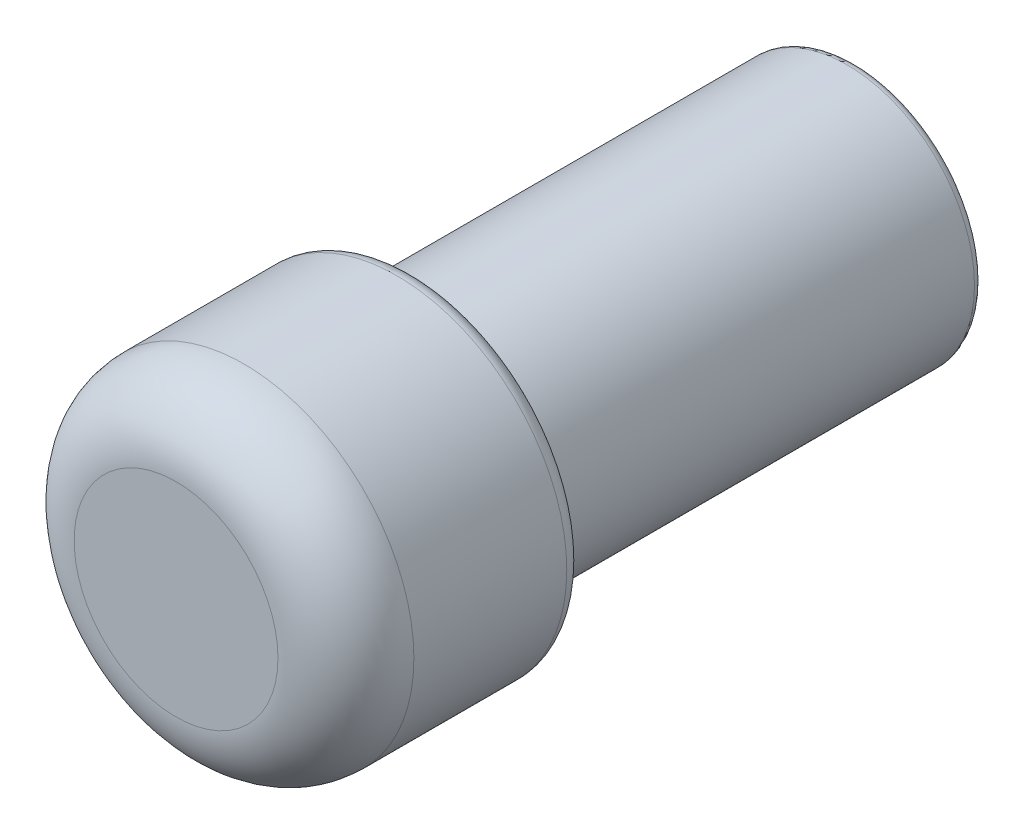
ISO-10303-21;
HEADER;
FILE_DESCRIPTION(('STEP AP214'),'2;1');
FILE_NAME('part.step','',(''),(''),'','','');
FILE_SCHEMA(('AUTOMOTIVE_DESIGN { 1 0 10303 214 1 1 1 1 }'));
ENDSEC;
DATA;
#1=APPLICATION_CONTEXT('core data for automotive mechanical design processes');
#2=APPLICATION_PROTOCOL_DEFINITION('international standard','automotive_design',2000,#1);
#3=PRODUCT_CONTEXT('',#1,'mechanical');
#4=PRODUCT('Part','Part','',(#3));
#5=PRODUCT_RELATED_PRODUCT_CATEGORY('part','',(#4));
#6=PRODUCT_DEFINITION_FORMATION('','',#4);
#7=PRODUCT_DEFINITION_CONTEXT('part definition',#1,'design');
#8=PRODUCT_DEFINITION('design','',#6,#7);
#9=PRODUCT_DEFINITION_SHAPE('','',#8);
#10=(LENGTH_UNIT() NAMED_UNIT(*) SI_UNIT(.MILLI.,.METRE.));
#11=(NAMED_UNIT(*) PLANE_ANGLE_UNIT() SI_UNIT($,.RADIAN.));
#12=(NAMED_UNIT(*) SI_UNIT($,.STERADIAN.) SOLID_ANGLE_UNIT());
#13=UNCERTAINTY_MEASURE_WITH_UNIT(LENGTH_MEASURE(1.E-05),#10,'distance_accuracy_value','');
#14=(GEOMETRIC_REPRESENTATION_CONTEXT(3) GLOBAL_UNCERTAINTY_ASSIGNED_CONTEXT((#13)) GLOBAL_UNIT_ASSIGNED_CONTEXT((#10,
#11,#12)) REPRESENTATION_CONTEXT('',''));
#15=CARTESIAN_POINT('',(0.,0.,0.));
#16=DIRECTION('',(0.,0.,1.));
#17=DIRECTION('',(1.,0.,0.));
#18=AXIS2_PLACEMENT_3D('',#15,#16,#17);
#19=CARTESIAN_POINT('',(0.,0.,13.));
#20=DIRECTION('',(0.,0.,-1.));
#21=DIRECTION('',(-1.,0.,0.));
#22=AXIS2_PLACEMENT_3D('',#19,#20,#21);
#23=CYLINDRICAL_SURFACE('',#22,3.75);
#24=CARTESIAN_POINT('',(0.,0.,0.25));
#25=DIRECTION('',(0.,0.,1.));
#26=DIRECTION('',(1.,0.,0.));
#27=AXIS2_PLACEMENT_3D('',#24,#25,#26);
#28=CIRCLE('',#27,3.75);
#29=CARTESIAN_POINT('',(-3.75,0.,0.25));
#30=VERTEX_POINT('',#29);
#31=EDGE_CURVE('E56',#30,#30,#28,.T.);
#32=CARTESIAN_POINT('',(0.,0.,12.5));
#33=DIRECTION('',(0.,0.,1.));
#34=DIRECTION('',(1.,0.,0.));
#35=AXIS2_PLACEMENT_3D('',#32,#33,#34);
#36=CIRCLE('',#35,3.75);
#37=CARTESIAN_POINT('',(-3.75,0.,12.5));
#38=VERTEX_POINT('',#37);
#39=EDGE_CURVE('E59',#38,#38,#36,.F.);
#40=CARTESIAN_POINT('',(-3.75,0.,0.25));
#41=CARTESIAN_POINT('',(-3.75,0.,0.377604166666667));
#42=CARTESIAN_POINT('',(-3.75,0.,0.505208333333333));
#43=CARTESIAN_POINT('',(-3.75,0.,0.760416666666667));
#44=CARTESIAN_POINT('',(-3.75,0.,0.888020833333334));
#45=CARTESIAN_POINT('',(-3.75,0.,1.14322916666667));
#46=CARTESIAN_POINT('',(-3.75,0.,1.27083333333333));
#47=CARTESIAN_POINT('',(-3.75,0.,1.52604166666667));
#48=CARTESIAN_POINT('',(-3.75,0.,1.65364583333333));
#49=CARTESIAN_POINT('',(-3.75,0.,1.90885416666667));
#50=CARTESIAN_POINT('',(-3.75,0.,2.03645833333333));
#51=CARTESIAN_POINT('',(-3.75,0.,2.29166666666667));
#52=CARTESIAN_POINT('',(-3.75,0.,2.41927083333333));
#53=CARTESIAN_POINT('',(-3.75,0.,2.67447916666667));
#54=CARTESIAN_POINT('',(-3.75,0.,2.80208333333333));
#55=CARTESIAN_POINT('',(-3.75,0.,3.05729166666667));
#56=CARTESIAN_POINT('',(-3.75,0.,3.18489583333333));
#57=CARTESIAN_POINT('',(-3.75,0.,3.44010416666667));
#58=CARTESIAN_POINT('',(-3.75,0.,3.56770833333333));
#59=CARTESIAN_POINT('',(-3.75,0.,3.82291666666667));
#60=CARTESIAN_POINT('',(-3.75,0.,3.95052083333333));
#61=CARTESIAN_POINT('',(-3.75,0.,4.20572916666667));
#62=CARTESIAN_POINT('',(-3.75,0.,4.33333333333333));
#63=CARTESIAN_POINT('',(-3.75,0.,4.58854166666667));
#64=CARTESIAN_POINT('',(-3.75,0.,4.71614583333333));
#65=CARTESIAN_POINT('',(-3.75,0.,4.97135416666667));
#66=CARTESIAN_POINT('',(-3.75,0.,5.09895833333333));
#67=CARTESIAN_POINT('',(-3.75,0.,5.35416666666667));
#68=CARTESIAN_POINT('',(-3.75,0.,5.48177083333333));
#69=CARTESIAN_POINT('',(-3.75,0.,5.73697916666667));
#70=CARTESIAN_POINT('',(-3.75,0.,5.86458333333333));
#71=CARTESIAN_POINT('',(-3.75,0.,6.11979166666667));
#72=CARTESIAN_POINT('',(-3.75,0.,6.24739583333333));
#73=CARTESIAN_POINT('',(-3.75,0.,6.50260416666667));
#74=CARTESIAN_POINT('',(-3.75,0.,6.63020833333333));
#75=CARTESIAN_POINT('',(-3.75,0.,6.88541666666667));
#76=CARTESIAN_POINT('',(-3.75,0.,7.01302083333333));
#77=CARTESIAN_POINT('',(-3.75,0.,7.26822916666667));
#78=CARTESIAN_POINT('',(-3.75,0.,7.39583333333333));
#79=CARTESIAN_POINT('',(-3.75,0.,7.65104166666667));
#80=CARTESIAN_POINT('',(-3.75,0.,7.77864583333333));
#81=CARTESIAN_POINT('',(-3.75,0.,8.03385416666667));
#82=CARTESIAN_POINT('',(-3.75,0.,8.16145833333333));
#83=CARTESIAN_POINT('',(-3.75,0.,8.41666666666667));
#84=CARTESIAN_POINT('',(-3.75,0.,8.54427083333333));
#85=CARTESIAN_POINT('',(-3.75,0.,8.79947916666667));
#86=CARTESIAN_POINT('',(-3.75,0.,8.92708333333333));
#87=CARTESIAN_POINT('',(-3.75,0.,9.18229166666666));
#88=CARTESIAN_POINT('',(-3.75,0.,9.30989583333333));
#89=CARTESIAN_POINT('',(-3.75,0.,9.56510416666667));
#90=CARTESIAN_POINT('',(-3.75,0.,9.69270833333333));
#91=CARTESIAN_POINT('',(-3.75,0.,9.94791666666667));
#92=CARTESIAN_POINT('',(-3.75,0.,10.0755208333333));
#93=CARTESIAN_POINT('',(-3.75,0.,10.3307291666667));
#94=CARTESIAN_POINT('',(-3.75,0.,10.4583333333333));
#95=CARTESIAN_POINT('',(-3.75,0.,10.7135416666667));
#96=CARTESIAN_POINT('',(-3.75,0.,10.8411458333333));
#97=CARTESIAN_POINT('',(-3.75,0.,11.0963541666667));
#98=CARTESIAN_POINT('',(-3.75,0.,11.2239583333333));
#99=CARTESIAN_POINT('',(-3.75,0.,11.4791666666667));
#100=CARTESIAN_POINT('',(-3.75,0.,11.6067708333333));
#101=CARTESIAN_POINT('',(-3.75,0.,11.8619791666667));
#102=CARTESIAN_POINT('',(-3.75,0.,11.9895833333333));
#103=CARTESIAN_POINT('',(-3.75,0.,12.2447916666667));
#104=CARTESIAN_POINT('',(-3.75,0.,12.3723958333333));
#105=CARTESIAN_POINT('',(-3.75,0.,12.5));
#106=B_SPLINE_CURVE_WITH_KNOTS('',3,(#40,#41,#42,#43,#44,#45,#46,#47,#48,#49,#50,#51,#52,#53,
#54,#55,#56,#57,#58,#59,#60,#61,#62,#63,#64,#65,#66,#67,#68,#69,#70,#71,#72,#73,#74,#75,#76,#77,
#78,#79,#80,#81,#82,#83,#84,#85,#86,#87,#88,#89,#90,#91,#92,#93,#94,#95,#96,#97,#98,#99,#100,
#101,#102,#103,#104,#105),.UNSPECIFIED.,.F.,.F.,(4,2,2,2,2,2,2,2,2,2,2,2,2,2,2,2,2,2,2,2,2,2,2,
2,2,2,2,2,2,2,2,2,4),(0.,0.382812499999999,0.765625000000001,1.1484375,1.53125,1.9140625,
2.296875,2.6796875,3.0625,3.4453125,3.828125,4.2109375,4.59375,4.9765625,5.359375,5.7421875,
6.125,6.5078125,6.890625,7.2734375,7.65625,8.0390625,8.421875,8.8046875,9.1875,9.5703125,
9.953125,10.3359375,10.71875,11.1015625,11.484375,11.8671875,12.25),.UNSPECIFIED.);
#107=EDGE_CURVE('BSEAM33',#30,#38,#106,.T.);
#108=ORIENTED_EDGE('',*,*,#31,.T.);
#109=ORIENTED_EDGE('',*,*,#39,.T.);
#110=ORIENTED_EDGE('',*,*,#107,.T.);
#111=ORIENTED_EDGE('',*,*,#107,.F.);
#112=EDGE_LOOP('',(#108,#110,#109,#111));
#113=FACE_BOUND('',#112,.T.);
#114=ADVANCED_FACE('F33',(#113),#23,.T.);
#115=CARTESIAN_POINT('',(0.,0.,0.));
#116=DIRECTION('',(0.,0.,1.));
#117=DIRECTION('',(1.,0.,0.));
#118=AXIS2_PLACEMENT_3D('',#115,#116,#117);
#119=PLANE('',#118);
#120=CARTESIAN_POINT('',(0.,0.,0.));
#121=DIRECTION('',(0.,0.,1.));
#122=DIRECTION('',(1.,0.,0.));
#123=AXIS2_PLACEMENT_3D('',#120,#121,#122);
#124=CIRCLE('',#123,3.5);
#125=CARTESIAN_POINT('',(3.5,0.,0.));
#126=VERTEX_POINT('',#125);
#127=EDGE_CURVE('E48',#126,#126,#124,.F.);
#128=ORIENTED_EDGE('',*,*,#127,.T.);
#129=EDGE_LOOP('',(#128));
#130=FACE_BOUND('',#129,.T.);
#131=CARTESIAN_POINT('',(0.,0.,0.));
#132=DIRECTION('',(0.,0.,1.));
#133=DIRECTION('',(1.,0.,0.));
#134=AXIS2_PLACEMENT_3D('',#131,#132,#133);
#135=CIRCLE('',#134,3.1);
#136=CARTESIAN_POINT('',(3.1,0.,0.));
#137=VERTEX_POINT('',#136);
#138=EDGE_CURVE('E53',#137,#137,#135,.T.);
#139=ORIENTED_EDGE('',*,*,#138,.T.);
#140=EDGE_LOOP('',(#139));
#141=FACE_BOUND('',#140,.T.);
#142=ADVANCED_FACE('F93',(#130,#141),#119,.F.);
#143=CARTESIAN_POINT('',(0.,0.,20.));
#144=DIRECTION('',(0.,0.,-1.));
#145=DIRECTION('',(-1.,0.,0.));
#146=AXIS2_PLACEMENT_3D('',#143,#144,#145);
#147=CYLINDRICAL_SURFACE('',#146,5.);
#148=CARTESIAN_POINT('',(0.,0.,18.));
#149=DIRECTION('',(0.,0.,1.));
#150=DIRECTION('',(1.,0.,0.));
#151=AXIS2_PLACEMENT_3D('',#148,#149,#150);
#152=CIRCLE('',#151,5.);
#153=CARTESIAN_POINT('',(5.,0.,18.));
#154=VERTEX_POINT('',#153);
#155=EDGE_CURVE('E10',#154,#154,#152,.F.);
#156=ORIENTED_EDGE('',*,*,#155,.T.);
#157=EDGE_LOOP('',(#156));
#158=FACE_BOUND('',#157,.T.);
#159=CARTESIAN_POINT('',(0.,0.,13.5));
#160=DIRECTION('',(0.,0.,1.));
#161=DIRECTION('',(1.,0.,0.));
#162=AXIS2_PLACEMENT_3D('',#159,#160,#161);
#163=CIRCLE('',#162,5.);
#164=CARTESIAN_POINT('',(5.,0.,13.5));
#165=VERTEX_POINT('',#164);
#166=EDGE_CURVE('E68',#165,#165,#163,.T.);
#167=ORIENTED_EDGE('',*,*,#166,.T.);
#168=EDGE_LOOP('',(#167));
#169=FACE_BOUND('',#168,.T.);
#170=ADVANCED_FACE('F99',(#158,#169),#147,.T.);
#171=CARTESIAN_POINT('',(0.,0.,20.));
#172=DIRECTION('',(0.,0.,1.));
#173=DIRECTION('',(1.,0.,0.));
#174=AXIS2_PLACEMENT_3D('',#171,#172,#173);
#175=PLANE('',#174);
#176=CARTESIAN_POINT('',(0.,0.,20.));
#177=DIRECTION('',(0.,0.,1.));
#178=DIRECTION('',(1.,0.,0.));
#179=AXIS2_PLACEMENT_3D('',#176,#177,#178);
#180=CIRCLE('',#179,3.);
#181=CARTESIAN_POINT('',(3.,0.,20.));
#182=VERTEX_POINT('',#181);
#183=EDGE_CURVE('E40',#182,#182,#180,.T.);
#184=ORIENTED_EDGE('',*,*,#183,.T.);
#185=EDGE_LOOP('',(#184));
#186=FACE_BOUND('',#185,.T.);
#187=ADVANCED_FACE('F88',(#186),#175,.T.);
#188=CARTESIAN_POINT('',(0.,0.,13.));
#189=DIRECTION('',(0.,0.,1.));
#190=DIRECTION('',(1.,0.,0.));
#191=AXIS2_PLACEMENT_3D('',#188,#189,#190);
#192=PLANE('',#191);
#193=CARTESIAN_POINT('',(0.,0.,13.));
#194=DIRECTION('',(0.,0.,1.));
#195=DIRECTION('',(1.,0.,0.));
#196=AXIS2_PLACEMENT_3D('',#193,#194,#195);
#197=CIRCLE('',#196,4.5);
#198=CARTESIAN_POINT('',(4.5,0.,13.));
#199=VERTEX_POINT('',#198);
#200=EDGE_CURVE('E62',#199,#199,#197,.F.);
#201=ORIENTED_EDGE('',*,*,#200,.T.);
#202=EDGE_LOOP('',(#201));
#203=FACE_BOUND('',#202,.T.);
#204=CARTESIAN_POINT('',(0.,0.,13.));
#205=DIRECTION('',(0.,0.,1.));
#206=DIRECTION('',(1.,0.,0.));
#207=AXIS2_PLACEMENT_3D('',#204,#205,#206);
#208=CIRCLE('',#207,4.25);
#209=CARTESIAN_POINT('',(4.25,0.,13.));
#210=VERTEX_POINT('',#209);
#211=EDGE_CURVE('E65',#210,#210,#208,.T.);
#212=ORIENTED_EDGE('',*,*,#211,.T.);
#213=EDGE_LOOP('',(#212));
#214=FACE_BOUND('',#213,.T.);
#215=ADVANCED_FACE('F79',(#203,#214),#192,.F.);
#216=CARTESIAN_POINT('',(0.,0.,15.));
#217=DIRECTION('',(0.,0.,-1.));
#218=DIRECTION('',(-1.,0.,0.));
#219=AXIS2_PLACEMENT_3D('',#216,#217,#218);
#220=CYLINDRICAL_SURFACE('',#219,2.85);
#221=CARTESIAN_POINT('',(0.,0.,0.25));
#222=DIRECTION('',(0.,0.,1.));
#223=DIRECTION('',(1.,0.,0.));
#224=AXIS2_PLACEMENT_3D('',#221,#222,#223);
#225=CIRCLE('',#224,2.85);
#226=CARTESIAN_POINT('',(2.85,0.,0.25));
#227=VERTEX_POINT('',#226);
#228=EDGE_CURVE('E44',#227,#227,#225,.F.);
#229=ORIENTED_EDGE('',*,*,#228,.T.);
#230=EDGE_LOOP('',(#229));
#231=FACE_BOUND('',#230,.T.);
#232=CARTESIAN_POINT('',(0.,0.,15.));
#233=DIRECTION('',(0.,0.,-1.));
#234=DIRECTION('',(-1.,0.,0.));
#235=AXIS2_PLACEMENT_3D('',#232,#233,#234);
#236=CIRCLE('',#235,2.85);
#237=CARTESIAN_POINT('',(-2.85,0.,15.));
#238=VERTEX_POINT('',#237);
#239=EDGE_CURVE('E71',#238,#238,#236,.T.);
#240=ORIENTED_EDGE('',*,*,#239,.F.);
#241=EDGE_LOOP('',(#240));
#242=FACE_BOUND('',#241,.T.);
#243=ADVANCED_FACE('F77',(#231,#242),#220,.F.);
#244=CARTESIAN_POINT('',(0.,0.,15.));
#245=DIRECTION('',(0.,0.,-1.));
#246=DIRECTION('',(-1.,0.,0.));
#247=AXIS2_PLACEMENT_3D('',#244,#245,#246);
#248=PLANE('',#247);
#249=ORIENTED_EDGE('',*,*,#239,.T.);
#250=EDGE_LOOP('',(#249));
#251=FACE_BOUND('',#250,.T.);
#252=ADVANCED_FACE('F75',(#251),#248,.T.);
#253=CARTESIAN_POINT('',(0.,0.,13.5));
#254=DIRECTION('',(0.,0.,1.));
#255=DIRECTION('',(1.,0.,0.));
#256=AXIS2_PLACEMENT_3D('',#253,#254,#255);
#257=TOROIDAL_SURFACE('',#256,4.5,0.5);
#258=ORIENTED_EDGE('',*,*,#200,.F.);
#259=EDGE_LOOP('',(#258));
#260=FACE_BOUND('',#259,.T.);
#261=ORIENTED_EDGE('',*,*,#166,.F.);
#262=EDGE_LOOP('',(#261));
#263=FACE_BOUND('',#262,.T.);
#264=ADVANCED_FACE('F86',(#260,#263),#257,.T.);
#265=CARTESIAN_POINT('',(0.,0.,12.5));
#266=DIRECTION('',(0.,0.,1.));
#267=DIRECTION('',(1.,0.,0.));
#268=AXIS2_PLACEMENT_3D('',#265,#266,#267);
#269=TOROIDAL_SURFACE('',#268,4.25,0.5);
#270=ORIENTED_EDGE('',*,*,#39,.F.);
#271=EDGE_LOOP('',(#270));
#272=FACE_BOUND('',#271,.T.);
#273=ORIENTED_EDGE('',*,*,#211,.F.);
#274=EDGE_LOOP('',(#273));
#275=FACE_BOUND('',#274,.T.);
#276=ADVANCED_FACE('F107',(#272,#275),#269,.F.);
#277=CARTESIAN_POINT('',(0.,0.,0.25));
#278=DIRECTION('',(0.,0.,1.));
#279=DIRECTION('',(1.,0.,0.));
#280=AXIS2_PLACEMENT_3D('',#277,#278,#279);
#281=TOROIDAL_SURFACE('',#280,3.5,0.25);
#282=ORIENTED_EDGE('',*,*,#127,.F.);
#283=EDGE_LOOP('',(#282));
#284=FACE_BOUND('',#283,.T.);
#285=ORIENTED_EDGE('',*,*,#31,.F.);
#286=EDGE_LOOP('',(#285));
#287=FACE_BOUND('',#286,.T.);
#288=ADVANCED_FACE('F111',(#284,#287),#281,.T.);
#289=CARTESIAN_POINT('',(0.,0.,0.25));
#290=DIRECTION('',(0.,0.,1.));
#291=DIRECTION('',(1.,0.,0.));
#292=AXIS2_PLACEMENT_3D('',#289,#290,#291);
#293=TOROIDAL_SURFACE('',#292,3.1,0.25);
#294=ORIENTED_EDGE('',*,*,#138,.F.);
#295=EDGE_LOOP('',(#294));
#296=FACE_BOUND('',#295,.T.);
#297=ORIENTED_EDGE('',*,*,#228,.F.);
#298=EDGE_LOOP('',(#297));
#299=FACE_BOUND('',#298,.T.);
#300=ADVANCED_FACE('F114',(#296,#299),#293,.T.);
#301=CARTESIAN_POINT('',(0.,0.,18.));
#302=DIRECTION('',(0.,0.,1.));
#303=DIRECTION('',(1.,0.,0.));
#304=AXIS2_PLACEMENT_3D('',#301,#302,#303);
#305=TOROIDAL_SURFACE('',#304,3.,2.);
#306=ORIENTED_EDGE('',*,*,#155,.F.);
#307=EDGE_LOOP('',(#306));
#308=FACE_BOUND('',#307,.T.);
#309=ORIENTED_EDGE('',*,*,#183,.F.);
#310=EDGE_LOOP('',(#309));
#311=FACE_BOUND('',#310,.T.);
#312=ADVANCED_FACE('F35',(#308,#311),#305,.T.);
#313=CLOSED_SHELL('',(#114,#142,#170,#187,#215,#243,#252,#264,#276,#288,#300,#312));
#314=MANIFOLD_SOLID_BREP('B2',#313);
#315=ADVANCED_BREP_SHAPE_REPRESENTATION('',(#18,#314),#14);
#316=SHAPE_DEFINITION_REPRESENTATION(#9,#315);
ENDSEC;
END-ISO-10303-21;
